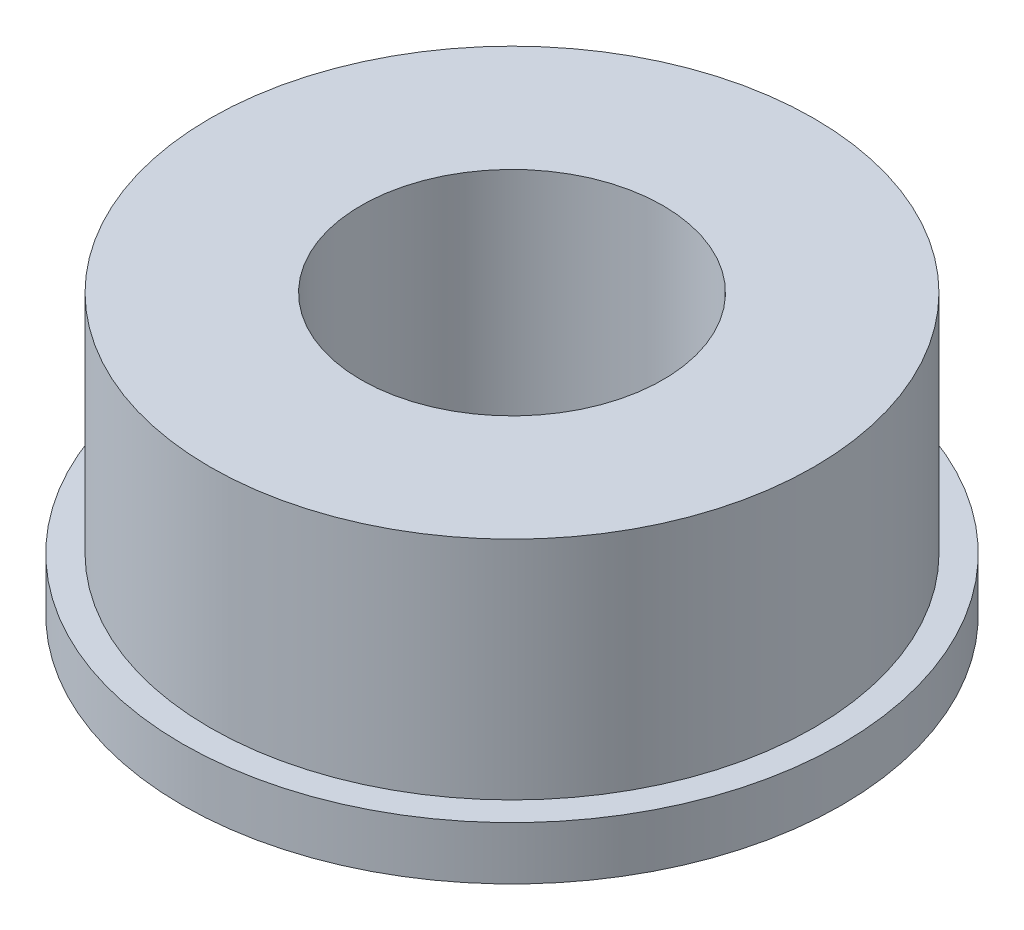
ISO-10303-21;
HEADER;
FILE_DESCRIPTION(('STEP AP214'),'2;1');
FILE_NAME('part.step','',(''),(''),'','','');
FILE_SCHEMA(('AUTOMOTIVE_DESIGN { 1 0 10303 214 1 1 1 1 }'));
ENDSEC;
DATA;
#1=APPLICATION_CONTEXT('core data for automotive mechanical design processes');
#2=APPLICATION_PROTOCOL_DEFINITION('international standard','automotive_design',2000,#1);
#3=PRODUCT_CONTEXT('',#1,'mechanical');
#4=PRODUCT('Part','Part','',(#3));
#5=PRODUCT_RELATED_PRODUCT_CATEGORY('part','',(#4));
#6=PRODUCT_DEFINITION_FORMATION('','',#4);
#7=PRODUCT_DEFINITION_CONTEXT('part definition',#1,'design');
#8=PRODUCT_DEFINITION('design','',#6,#7);
#9=PRODUCT_DEFINITION_SHAPE('','',#8);
#10=(LENGTH_UNIT() NAMED_UNIT(*) SI_UNIT(.MILLI.,.METRE.));
#11=(NAMED_UNIT(*) PLANE_ANGLE_UNIT() SI_UNIT($,.RADIAN.));
#12=(NAMED_UNIT(*) SI_UNIT($,.STERADIAN.) SOLID_ANGLE_UNIT());
#13=UNCERTAINTY_MEASURE_WITH_UNIT(LENGTH_MEASURE(1.E-05),#10,'distance_accuracy_value','');
#14=(GEOMETRIC_REPRESENTATION_CONTEXT(3) GLOBAL_UNCERTAINTY_ASSIGNED_CONTEXT((#13)) GLOBAL_UNIT_ASSIGNED_CONTEXT((#10,
#11,#12)) REPRESENTATION_CONTEXT('',''));
#15=CARTESIAN_POINT('',(0.,0.,0.));
#16=DIRECTION('',(0.,0.,1.));
#17=DIRECTION('',(1.,0.,0.));
#18=AXIS2_PLACEMENT_3D('',#15,#16,#17);
#19=CARTESIAN_POINT('',(0.,4.7498,0.));
#20=DIRECTION('',(0.,-1.,0.));
#21=DIRECTION('',(0.,0.,-1.));
#22=AXIS2_PLACEMENT_3D('',#19,#20,#21);
#23=CYLINDRICAL_SURFACE('',#22,6.35);
#24=CARTESIAN_POINT('',(0.,4.7498,0.));
#25=DIRECTION('',(0.,1.,0.));
#26=DIRECTION('',(0.,0.,1.));
#27=AXIS2_PLACEMENT_3D('',#24,#25,#26);
#28=CIRCLE('',#27,6.35);
#29=CARTESIAN_POINT('',(0.,4.7498,6.35));
#30=VERTEX_POINT('',#29);
#31=EDGE_CURVE('E10',#30,#30,#28,.T.);
#32=ORIENTED_EDGE('',*,*,#31,.F.);
#33=EDGE_LOOP('',(#32));
#34=FACE_BOUND('',#33,.T.);
#35=CARTESIAN_POINT('',(0.,0.,0.));
#36=DIRECTION('',(0.,1.,0.));
#37=DIRECTION('',(0.,0.,1.));
#38=AXIS2_PLACEMENT_3D('',#35,#36,#37);
#39=CIRCLE('',#38,6.35);
#40=CARTESIAN_POINT('',(0.,0.,6.35));
#41=VERTEX_POINT('',#40);
#42=EDGE_CURVE('E35',#41,#41,#39,.T.);
#43=ORIENTED_EDGE('',*,*,#42,.T.);
#44=EDGE_LOOP('',(#43));
#45=FACE_BOUND('',#44,.T.);
#46=ADVANCED_FACE('F32',(#34,#45),#23,.T.);
#47=CARTESIAN_POINT('',(0.,4.7498,0.));
#48=DIRECTION('',(0.,1.,0.));
#49=DIRECTION('',(0.,0.,1.));
#50=AXIS2_PLACEMENT_3D('',#47,#48,#49);
#51=PLANE('',#50);
#52=CARTESIAN_POINT('',(0.,4.7498,0.));
#53=DIRECTION('',(0.,1.,0.));
#54=DIRECTION('',(0.,0.,1.));
#55=AXIS2_PLACEMENT_3D('',#52,#53,#54);
#56=CIRCLE('',#55,3.175);
#57=CARTESIAN_POINT('',(0.,4.7498,3.175));
#58=VERTEX_POINT('',#57);
#59=EDGE_CURVE('E47',#58,#58,#56,.T.);
#60=ORIENTED_EDGE('',*,*,#59,.F.);
#61=EDGE_LOOP('',(#60));
#62=FACE_BOUND('',#61,.T.);
#63=ORIENTED_EDGE('',*,*,#31,.T.);
#64=EDGE_LOOP('',(#63));
#65=FACE_BOUND('',#64,.T.);
#66=ADVANCED_FACE('F58',(#62,#65),#51,.T.);
#67=CARTESIAN_POINT('',(0.,-1.1176,0.));
#68=DIRECTION('',(0.,1.,0.));
#69=DIRECTION('',(0.,0.,1.));
#70=AXIS2_PLACEMENT_3D('',#67,#68,#69);
#71=CYLINDRICAL_SURFACE('',#70,6.9342);
#72=CARTESIAN_POINT('',(0.,-1.1176,0.));
#73=DIRECTION('',(0.,-1.,0.));
#74=DIRECTION('',(0.,0.,-1.));
#75=AXIS2_PLACEMENT_3D('',#72,#73,#74);
#76=CIRCLE('',#75,6.9342);
#77=CARTESIAN_POINT('',(0.,-1.1176,-6.9342));
#78=VERTEX_POINT('',#77);
#79=EDGE_CURVE('E42',#78,#78,#76,.T.);
#80=ORIENTED_EDGE('',*,*,#79,.F.);
#81=EDGE_LOOP('',(#80));
#82=FACE_BOUND('',#81,.T.);
#83=CARTESIAN_POINT('',(0.,0.,0.));
#84=DIRECTION('',(0.,-1.,0.));
#85=DIRECTION('',(0.,0.,-1.));
#86=AXIS2_PLACEMENT_3D('',#83,#84,#85);
#87=CIRCLE('',#86,6.9342);
#88=CARTESIAN_POINT('',(0.,0.,-6.9342));
#89=VERTEX_POINT('',#88);
#90=EDGE_CURVE('E44',#89,#89,#87,.T.);
#91=ORIENTED_EDGE('',*,*,#90,.T.);
#92=EDGE_LOOP('',(#91));
#93=FACE_BOUND('',#92,.T.);
#94=ADVANCED_FACE('F60',(#82,#93),#71,.T.);
#95=CARTESIAN_POINT('',(0.,-1.1176,0.));
#96=DIRECTION('',(0.,-1.,0.));
#97=DIRECTION('',(0.,0.,-1.));
#98=AXIS2_PLACEMENT_3D('',#95,#96,#97);
#99=PLANE('',#98);
#100=CARTESIAN_POINT('',(0.,-1.1176,0.));
#101=DIRECTION('',(0.,-1.,0.));
#102=DIRECTION('',(0.,0.,-1.));
#103=AXIS2_PLACEMENT_3D('',#100,#101,#102);
#104=CIRCLE('',#103,3.175);
#105=CARTESIAN_POINT('',(0.,-1.1176,-3.175));
#106=VERTEX_POINT('',#105);
#107=EDGE_CURVE('E50',#106,#106,#104,.F.);
#108=ORIENTED_EDGE('',*,*,#107,.T.);
#109=EDGE_LOOP('',(#108));
#110=FACE_BOUND('',#109,.T.);
#111=ORIENTED_EDGE('',*,*,#79,.T.);
#112=EDGE_LOOP('',(#111));
#113=FACE_BOUND('',#112,.T.);
#114=ADVANCED_FACE('F65',(#110,#113),#99,.T.);
#115=CARTESIAN_POINT('',(0.,0.,0.));
#116=DIRECTION('',(0.,-1.,0.));
#117=DIRECTION('',(0.,0.,-1.));
#118=AXIS2_PLACEMENT_3D('',#115,#116,#117);
#119=PLANE('',#118);
#120=ORIENTED_EDGE('',*,*,#42,.F.);
#121=EDGE_LOOP('',(#120));
#122=FACE_BOUND('',#121,.T.);
#123=ORIENTED_EDGE('',*,*,#90,.F.);
#124=EDGE_LOOP('',(#123));
#125=FACE_BOUND('',#124,.T.);
#126=ADVANCED_FACE('F70',(#122,#125),#119,.F.);
#127=CARTESIAN_POINT('',(0.,-1.1186,0.));
#128=DIRECTION('',(0.,1.,0.));
#129=DIRECTION('',(0.,0.,1.));
#130=AXIS2_PLACEMENT_3D('',#127,#128,#129);
#131=CYLINDRICAL_SURFACE('',#130,3.175);
#132=ORIENTED_EDGE('',*,*,#107,.F.);
#133=EDGE_LOOP('',(#132));
#134=FACE_BOUND('',#133,.T.);
#135=ORIENTED_EDGE('',*,*,#59,.T.);
#136=EDGE_LOOP('',(#135));
#137=FACE_BOUND('',#136,.T.);
#138=ADVANCED_FACE('F56',(#134,#137),#131,.F.);
#139=CLOSED_SHELL('',(#46,#66,#94,#114,#126,#138));
#140=MANIFOLD_SOLID_BREP('B2',#139);
#141=ADVANCED_BREP_SHAPE_REPRESENTATION('',(#18,#140),#14);
#142=SHAPE_DEFINITION_REPRESENTATION(#9,#141);
ENDSEC;
END-ISO-10303-21;
